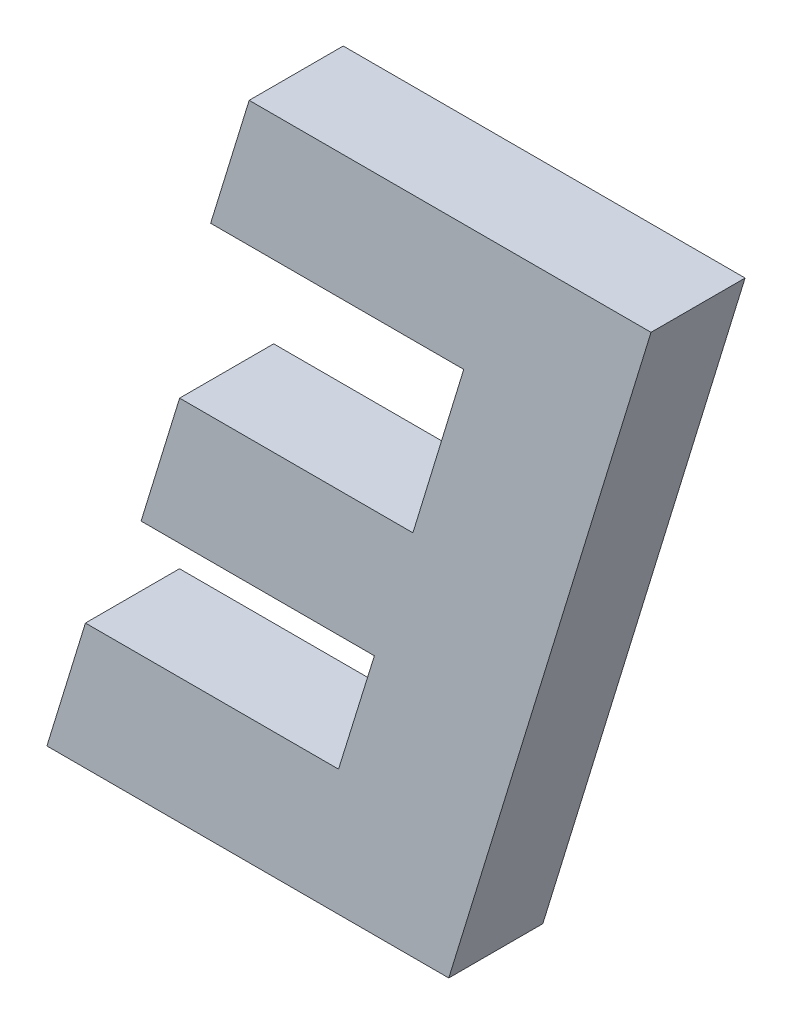
ISO-10303-21;
HEADER;
FILE_DESCRIPTION(('STEP AP214'),'2;1');
FILE_NAME('part.step','',(''),(''),'','','');
FILE_SCHEMA(('AUTOMOTIVE_DESIGN { 1 0 10303 214 1 1 1 1 }'));
ENDSEC;
DATA;
#1=APPLICATION_CONTEXT('core data for automotive mechanical design processes');
#2=APPLICATION_PROTOCOL_DEFINITION('international standard','automotive_design',2000,#1);
#3=PRODUCT_CONTEXT('',#1,'mechanical');
#4=PRODUCT('Part','Part','',(#3));
#5=PRODUCT_RELATED_PRODUCT_CATEGORY('part','',(#4));
#6=PRODUCT_DEFINITION_FORMATION('','',#4);
#7=PRODUCT_DEFINITION_CONTEXT('part definition',#1,'design');
#8=PRODUCT_DEFINITION('design','',#6,#7);
#9=PRODUCT_DEFINITION_SHAPE('','',#8);
#10=(LENGTH_UNIT() NAMED_UNIT(*) SI_UNIT(.MILLI.,.METRE.));
#11=(NAMED_UNIT(*) PLANE_ANGLE_UNIT() SI_UNIT($,.RADIAN.));
#12=(NAMED_UNIT(*) SI_UNIT($,.STERADIAN.) SOLID_ANGLE_UNIT());
#13=UNCERTAINTY_MEASURE_WITH_UNIT(LENGTH_MEASURE(1.E-05),#10,'distance_accuracy_value','');
#14=(GEOMETRIC_REPRESENTATION_CONTEXT(3) GLOBAL_UNCERTAINTY_ASSIGNED_CONTEXT((#13)) GLOBAL_UNIT_ASSIGNED_CONTEXT((#10,
#11,#12)) REPRESENTATION_CONTEXT('',''));
#15=CARTESIAN_POINT('',(0.,0.,0.));
#16=DIRECTION('',(0.,0.,1.));
#17=DIRECTION('',(1.,0.,0.));
#18=AXIS2_PLACEMENT_3D('',#15,#16,#17);
#19=CARTESIAN_POINT('',(5.3775022957308,0.710320131808521,0.));
#20=DIRECTION('',(0.,-1.,0.));
#21=DIRECTION('',(1.,0.,0.));
#22=AXIS2_PLACEMENT_3D('',#19,#20,#21);
#23=PLANE('',#22);
#24=DIRECTION('',(-1.,0.,0.));
#25=VECTOR('',#24,1.);
#26=CARTESIAN_POINT('',(5.8047324640157,0.710320131808521,0.));
#27=LINE('',#26,#25);
#28=CARTESIAN_POINT('',(5.8047324640157,0.710320131808521,0.));
#29=VERTEX_POINT('',#28);
#30=CARTESIAN_POINT('',(5.3775022957308,0.710320131808521,0.));
#31=VERTEX_POINT('',#30);
#32=EDGE_CURVE('E11',#29,#31,#27,.T.);
#33=ORIENTED_EDGE('',*,*,#32,.F.);
#34=DIRECTION('',(0.,0.,1.));
#35=VECTOR('',#34,1.);
#36=CARTESIAN_POINT('',(5.8047324640157,0.710320131808521,0.));
#37=LINE('',#36,#35);
#38=CARTESIAN_POINT('',(5.8047324640157,0.710320131808521,0.1));
#39=VERTEX_POINT('',#38);
#40=EDGE_CURVE('E24',#29,#39,#37,.T.);
#41=ORIENTED_EDGE('',*,*,#40,.T.);
#42=DIRECTION('',(1.,0.,0.));
#43=VECTOR('',#42,1.);
#44=CARTESIAN_POINT('',(5.8047324640157,0.710320131808521,0.1));
#45=LINE('',#44,#43);
#46=CARTESIAN_POINT('',(5.3775022957308,0.710320131808521,0.1));
#47=VERTEX_POINT('',#46);
#48=EDGE_CURVE('E124',#47,#39,#45,.T.);
#49=ORIENTED_EDGE('',*,*,#48,.F.);
#50=DIRECTION('',(0.,0.,1.));
#51=VECTOR('',#50,1.);
#52=CARTESIAN_POINT('',(5.3775022957308,0.710320131808521,0.));
#53=LINE('',#52,#51);
#54=EDGE_CURVE('E197',#31,#47,#53,.T.);
#55=ORIENTED_EDGE('',*,*,#54,.F.);
#56=EDGE_LOOP('',(#33,#41,#49,#55));
#57=FACE_BOUND('',#56,.T.);
#58=ADVANCED_FACE('F17',(#57),#23,.T.);
#59=CARTESIAN_POINT('',(5.4184617792415,0.844007334933629,0.));
#60=DIRECTION('',(-0.956130206843126,0.292942020820027,0.));
#61=DIRECTION('',(-0.292942020820027,-0.956130206843126,0.));
#62=AXIS2_PLACEMENT_3D('',#59,#60,#61);
#63=PLANE('',#62);
#64=DIRECTION('',(0.292942020820027,0.956130206843126,0.));
#65=VECTOR('',#64,1.);
#66=CARTESIAN_POINT('',(5.3775022957308,0.710320131808521,0.));
#67=LINE('',#66,#65);
#68=CARTESIAN_POINT('',(5.4184617792415,0.844007334933629,0.));
#69=VERTEX_POINT('',#68);
#70=EDGE_CURVE('E195',#31,#69,#67,.T.);
#71=ORIENTED_EDGE('',*,*,#70,.F.);
#72=ORIENTED_EDGE('',*,*,#54,.T.);
#73=DIRECTION('',(-0.292942020820027,-0.956130206843126,0.));
#74=VECTOR('',#73,1.);
#75=CARTESIAN_POINT('',(5.3775022957308,0.710320131808521,0.1));
#76=LINE('',#75,#74);
#77=CARTESIAN_POINT('',(5.4184617792415,0.844007334933629,0.1));
#78=VERTEX_POINT('',#77);
#79=EDGE_CURVE('E193',#78,#47,#76,.T.);
#80=ORIENTED_EDGE('',*,*,#79,.F.);
#81=DIRECTION('',(0.,0.,1.));
#82=VECTOR('',#81,1.);
#83=CARTESIAN_POINT('',(5.4184617792415,0.844007334933629,0.));
#84=LINE('',#83,#82);
#85=EDGE_CURVE('E190',#69,#78,#84,.T.);
#86=ORIENTED_EDGE('',*,*,#85,.F.);
#87=EDGE_LOOP('',(#71,#72,#80,#86));
#88=FACE_BOUND('',#87,.T.);
#89=ADVANCED_FACE('F235',(#88),#63,.T.);
#90=CARTESIAN_POINT('',(5.687542830638,0.844007334933629,0.));
#91=DIRECTION('',(0.,1.,0.));
#92=DIRECTION('',(-1.,0.,0.));
#93=AXIS2_PLACEMENT_3D('',#90,#91,#92);
#94=PLANE('',#93);
#95=DIRECTION('',(1.,0.,0.));
#96=VECTOR('',#95,1.);
#97=CARTESIAN_POINT('',(5.4184617792415,0.844007334933629,0.));
#98=LINE('',#97,#96);
#99=CARTESIAN_POINT('',(5.687542830638,0.844007334933629,0.));
#100=VERTEX_POINT('',#99);
#101=EDGE_CURVE('E188',#69,#100,#98,.T.);
#102=ORIENTED_EDGE('',*,*,#101,.F.);
#103=ORIENTED_EDGE('',*,*,#85,.T.);
#104=DIRECTION('',(-1.,0.,0.));
#105=VECTOR('',#104,1.);
#106=CARTESIAN_POINT('',(5.4184617792415,0.844007334933629,0.1));
#107=LINE('',#106,#105);
#108=CARTESIAN_POINT('',(5.687542830638,0.844007334933629,0.1));
#109=VERTEX_POINT('',#108);
#110=EDGE_CURVE('E185',#109,#78,#107,.T.);
#111=ORIENTED_EDGE('',*,*,#110,.F.);
#112=DIRECTION('',(0.,0.,1.));
#113=VECTOR('',#112,1.);
#114=CARTESIAN_POINT('',(5.687542830638,0.844007334933629,0.));
#115=LINE('',#114,#113);
#116=EDGE_CURVE('E182',#100,#109,#115,.T.);
#117=ORIENTED_EDGE('',*,*,#116,.F.);
#118=EDGE_LOOP('',(#102,#103,#111,#117));
#119=FACE_BOUND('',#118,.T.);
#120=ADVANCED_FACE('F231',(#119),#94,.T.);
#121=CARTESIAN_POINT('',(5.7256579055715,0.967454667181068,0.));
#122=DIRECTION('',(-0.955492945435698,0.295013950894893,0.));
#123=DIRECTION('',(-0.295013950894893,-0.955492945435698,0.));
#124=AXIS2_PLACEMENT_3D('',#121,#122,#123);
#125=PLANE('',#124);
#126=DIRECTION('',(0.295013950894893,0.955492945435698,0.));
#127=VECTOR('',#126,1.);
#128=CARTESIAN_POINT('',(5.687542830638,0.844007334933629,0.));
#129=LINE('',#128,#127);
#130=CARTESIAN_POINT('',(5.7256579055715,0.967454667181068,0.));
#131=VERTEX_POINT('',#130);
#132=EDGE_CURVE('E180',#100,#131,#129,.T.);
#133=ORIENTED_EDGE('',*,*,#132,.F.);
#134=ORIENTED_EDGE('',*,*,#116,.T.);
#135=DIRECTION('',(-0.295013950894893,-0.955492945435698,0.));
#136=VECTOR('',#135,1.);
#137=CARTESIAN_POINT('',(5.687542830638,0.844007334933629,0.1));
#138=LINE('',#137,#136);
#139=CARTESIAN_POINT('',(5.7256579055715,0.967454667181068,0.1));
#140=VERTEX_POINT('',#139);
#141=EDGE_CURVE('E177',#140,#109,#138,.T.);
#142=ORIENTED_EDGE('',*,*,#141,.F.);
#143=DIRECTION('',(0.,0.,1.));
#144=VECTOR('',#143,1.);
#145=CARTESIAN_POINT('',(5.7256579055715,0.967454667181068,0.));
#146=LINE('',#145,#144);
#147=EDGE_CURVE('E174',#131,#140,#146,.T.);
#148=ORIENTED_EDGE('',*,*,#147,.F.);
#149=EDGE_LOOP('',(#133,#134,#142,#148));
#150=FACE_BOUND('',#149,.T.);
#151=ADVANCED_FACE('F227',(#150),#125,.T.);
#152=CARTESIAN_POINT('',(5.4776254776458,0.967454667181068,0.));
#153=DIRECTION('',(0.,-1.,0.));
#154=DIRECTION('',(1.,0.,0.));
#155=AXIS2_PLACEMENT_3D('',#152,#153,#154);
#156=PLANE('',#155);
#157=DIRECTION('',(-1.,0.,0.));
#158=VECTOR('',#157,1.);
#159=CARTESIAN_POINT('',(5.7256579055715,0.967454667181068,0.));
#160=LINE('',#159,#158);
#161=CARTESIAN_POINT('',(5.4776254776458,0.967454667181068,0.));
#162=VERTEX_POINT('',#161);
#163=EDGE_CURVE('E172',#131,#162,#160,.T.);
#164=ORIENTED_EDGE('',*,*,#163,.F.);
#165=ORIENTED_EDGE('',*,*,#147,.T.);
#166=DIRECTION('',(1.,0.,0.));
#167=VECTOR('',#166,1.);
#168=CARTESIAN_POINT('',(5.7256579055715,0.967454667181068,0.1));
#169=LINE('',#168,#167);
#170=CARTESIAN_POINT('',(5.4776254776458,0.967454667181068,0.1));
#171=VERTEX_POINT('',#170);
#172=EDGE_CURVE('E169',#171,#140,#169,.T.);
#173=ORIENTED_EDGE('',*,*,#172,.F.);
#174=DIRECTION('',(0.,0.,1.));
#175=VECTOR('',#174,1.);
#176=CARTESIAN_POINT('',(5.4776254776458,0.967454667181068,0.));
#177=LINE('',#176,#175);
#178=EDGE_CURVE('E166',#162,#171,#177,.T.);
#179=ORIENTED_EDGE('',*,*,#178,.F.);
#180=EDGE_LOOP('',(#164,#165,#173,#179));
#181=FACE_BOUND('',#180,.T.);
#182=ADVANCED_FACE('F223',(#181),#156,.T.);
#183=CARTESIAN_POINT('',(5.5185849611564,1.1011418703062,0.));
#184=DIRECTION('',(-0.956130206843126,0.292942020820027,0.));
#185=DIRECTION('',(-0.292942020820027,-0.956130206843126,0.));
#186=AXIS2_PLACEMENT_3D('',#183,#184,#185);
#187=PLANE('',#186);
#188=DIRECTION('',(0.292942020820027,0.956130206843126,0.));
#189=VECTOR('',#188,1.);
#190=CARTESIAN_POINT('',(5.4776254776458,0.967454667181068,0.));
#191=LINE('',#190,#189);
#192=CARTESIAN_POINT('',(5.5185849611564,1.1011418703062,0.));
#193=VERTEX_POINT('',#192);
#194=EDGE_CURVE('E164',#162,#193,#191,.T.);
#195=ORIENTED_EDGE('',*,*,#194,.F.);
#196=ORIENTED_EDGE('',*,*,#178,.T.);
#197=DIRECTION('',(-0.292942020820027,-0.956130206843126,0.));
#198=VECTOR('',#197,1.);
#199=CARTESIAN_POINT('',(5.4776254776458,0.967454667181068,0.1));
#200=LINE('',#199,#198);
#201=CARTESIAN_POINT('',(5.5185849611564,1.1011418703062,0.1));
#202=VERTEX_POINT('',#201);
#203=EDGE_CURVE('E161',#202,#171,#200,.T.);
#204=ORIENTED_EDGE('',*,*,#203,.F.);
#205=DIRECTION('',(0.,0.,1.));
#206=VECTOR('',#205,1.);
#207=CARTESIAN_POINT('',(5.5185849611564,1.1011418703062,0.));
#208=LINE('',#207,#206);
#209=EDGE_CURVE('E158',#193,#202,#208,.T.);
#210=ORIENTED_EDGE('',*,*,#209,.F.);
#211=EDGE_LOOP('',(#195,#196,#204,#210));
#212=FACE_BOUND('',#211,.T.);
#213=ADVANCED_FACE('F219',(#212),#187,.T.);
#214=CARTESIAN_POINT('',(5.7666173890822,1.1011418703062,0.));
#215=DIRECTION('',(0.,1.,0.));
#216=DIRECTION('',(-1.,0.,0.));
#217=AXIS2_PLACEMENT_3D('',#214,#215,#216);
#218=PLANE('',#217);
#219=DIRECTION('',(1.,0.,0.));
#220=VECTOR('',#219,1.);
#221=CARTESIAN_POINT('',(5.5185849611564,1.1011418703062,0.));
#222=LINE('',#221,#220);
#223=CARTESIAN_POINT('',(5.7666173890822,1.1011418703062,0.));
#224=VERTEX_POINT('',#223);
#225=EDGE_CURVE('E156',#193,#224,#222,.T.);
#226=ORIENTED_EDGE('',*,*,#225,.F.);
#227=ORIENTED_EDGE('',*,*,#209,.T.);
#228=DIRECTION('',(-1.,0.,0.));
#229=VECTOR('',#228,1.);
#230=CARTESIAN_POINT('',(5.5185849611564,1.1011418703062,0.1));
#231=LINE('',#230,#229);
#232=CARTESIAN_POINT('',(5.7666173890822,1.1011418703062,0.1));
#233=VERTEX_POINT('',#232);
#234=EDGE_CURVE('E153',#233,#202,#231,.T.);
#235=ORIENTED_EDGE('',*,*,#234,.F.);
#236=DIRECTION('',(0.,0.,1.));
#237=VECTOR('',#236,1.);
#238=CARTESIAN_POINT('',(5.7666173890822,1.1011418703062,0.));
#239=LINE('',#238,#237);
#240=EDGE_CURVE('E150',#224,#233,#239,.T.);
#241=ORIENTED_EDGE('',*,*,#240,.F.);
#242=EDGE_LOOP('',(#226,#227,#235,#241));
#243=FACE_BOUND('',#242,.T.);
#244=ADVANCED_FACE('F215',(#243),#218,.T.);
#245=CARTESIAN_POINT('',(5.8206611520476,1.2786329655191,0.));
#246=DIRECTION('',(-0.95663673942414,0.291283622581068,0.));
#247=DIRECTION('',(-0.291283622581068,-0.95663673942414,0.));
#248=AXIS2_PLACEMENT_3D('',#245,#246,#247);
#249=PLANE('',#248);
#250=DIRECTION('',(0.291283622581068,0.95663673942414,0.));
#251=VECTOR('',#250,1.);
#252=CARTESIAN_POINT('',(5.7666173890822,1.1011418703062,0.));
#253=LINE('',#252,#251);
#254=CARTESIAN_POINT('',(5.8206611520476,1.2786329655191,0.));
#255=VERTEX_POINT('',#254);
#256=EDGE_CURVE('E148',#224,#255,#253,.T.);
#257=ORIENTED_EDGE('',*,*,#256,.F.);
#258=ORIENTED_EDGE('',*,*,#240,.T.);
#259=DIRECTION('',(-0.291283622581068,-0.95663673942414,0.));
#260=VECTOR('',#259,1.);
#261=CARTESIAN_POINT('',(5.7666173890822,1.1011418703062,0.1));
#262=LINE('',#261,#260);
#263=CARTESIAN_POINT('',(5.8206611520476,1.2786329655191,0.1));
#264=VERTEX_POINT('',#263);
#265=EDGE_CURVE('E145',#264,#233,#262,.T.);
#266=ORIENTED_EDGE('',*,*,#265,.F.);
#267=DIRECTION('',(0.,0.,1.));
#268=VECTOR('',#267,1.);
#269=CARTESIAN_POINT('',(5.8206611520476,1.2786329655191,0.));
#270=LINE('',#269,#268);
#271=EDGE_CURVE('E142',#255,#264,#270,.T.);
#272=ORIENTED_EDGE('',*,*,#271,.F.);
#273=EDGE_LOOP('',(#257,#258,#266,#272));
#274=FACE_BOUND('',#273,.T.);
#275=ADVANCED_FACE('F211',(#274),#249,.T.);
#276=CARTESIAN_POINT('',(5.5515801006511,1.2786329655191,0.));
#277=DIRECTION('',(0.,-1.,0.));
#278=DIRECTION('',(1.,0.,0.));
#279=AXIS2_PLACEMENT_3D('',#276,#277,#278);
#280=PLANE('',#279);
#281=DIRECTION('',(-1.,0.,0.));
#282=VECTOR('',#281,1.);
#283=CARTESIAN_POINT('',(5.8206611520476,1.2786329655191,0.));
#284=LINE('',#283,#282);
#285=CARTESIAN_POINT('',(5.5515801006511,1.2786329655191,0.));
#286=VERTEX_POINT('',#285);
#287=EDGE_CURVE('E140',#255,#286,#284,.T.);
#288=ORIENTED_EDGE('',*,*,#287,.F.);
#289=ORIENTED_EDGE('',*,*,#271,.T.);
#290=DIRECTION('',(1.,0.,0.));
#291=VECTOR('',#290,1.);
#292=CARTESIAN_POINT('',(5.8206611520476,1.2786329655191,0.1));
#293=LINE('',#292,#291);
#294=CARTESIAN_POINT('',(5.5515801006511,1.2786329655191,0.1));
#295=VERTEX_POINT('',#294);
#296=EDGE_CURVE('E137',#295,#264,#293,.T.);
#297=ORIENTED_EDGE('',*,*,#296,.F.);
#298=DIRECTION('',(0.,0.,1.));
#299=VECTOR('',#298,1.);
#300=CARTESIAN_POINT('',(5.5515801006511,1.2786329655191,0.));
#301=LINE('',#300,#299);
#302=EDGE_CURVE('E134',#286,#295,#301,.T.);
#303=ORIENTED_EDGE('',*,*,#302,.F.);
#304=EDGE_LOOP('',(#288,#289,#297,#303));
#305=FACE_BOUND('',#304,.T.);
#306=ADVANCED_FACE('F207',(#305),#280,.T.);
#307=CARTESIAN_POINT('',(5.5925395841618,1.4123201686442,0.));
#308=DIRECTION('',(-0.956130206843128,0.292942020820019,0.));
#309=DIRECTION('',(-0.292942020820019,-0.956130206843128,0.));
#310=AXIS2_PLACEMENT_3D('',#307,#308,#309);
#311=PLANE('',#310);
#312=DIRECTION('',(0.292942020820019,0.956130206843128,0.));
#313=VECTOR('',#312,1.);
#314=CARTESIAN_POINT('',(5.5515801006511,1.2786329655191,0.));
#315=LINE('',#314,#313);
#316=CARTESIAN_POINT('',(5.5925395841618,1.4123201686442,0.));
#317=VERTEX_POINT('',#316);
#318=EDGE_CURVE('E132',#286,#317,#315,.T.);
#319=ORIENTED_EDGE('',*,*,#318,.F.);
#320=ORIENTED_EDGE('',*,*,#302,.T.);
#321=DIRECTION('',(-0.292942020820019,-0.956130206843128,0.));
#322=VECTOR('',#321,1.);
#323=CARTESIAN_POINT('',(5.5515801006511,1.2786329655191,0.1));
#324=LINE('',#323,#322);
#325=CARTESIAN_POINT('',(5.5925395841618,1.4123201686442,0.1));
#326=VERTEX_POINT('',#325);
#327=EDGE_CURVE('E130',#326,#295,#324,.T.);
#328=ORIENTED_EDGE('',*,*,#327,.F.);
#329=DIRECTION('',(0.,0.,1.));
#330=VECTOR('',#329,1.);
#331=CARTESIAN_POINT('',(5.5925395841618,1.4123201686442,0.));
#332=LINE('',#331,#330);
#333=EDGE_CURVE('E109',#317,#326,#332,.T.);
#334=ORIENTED_EDGE('',*,*,#333,.F.);
#335=EDGE_LOOP('',(#319,#320,#328,#334));
#336=FACE_BOUND('',#335,.T.);
#337=ADVANCED_FACE('F205',(#336),#311,.T.);
#338=CARTESIAN_POINT('',(6.0197697524467,1.4123201686442,0.));
#339=DIRECTION('',(0.,1.,0.));
#340=DIRECTION('',(-1.,0.,0.));
#341=AXIS2_PLACEMENT_3D('',#338,#339,#340);
#342=PLANE('',#341);
#343=DIRECTION('',(1.,0.,0.));
#344=VECTOR('',#343,1.);
#345=CARTESIAN_POINT('',(5.5925395841618,1.4123201686442,0.));
#346=LINE('',#345,#344);
#347=CARTESIAN_POINT('',(6.0197697524467,1.4123201686442,0.));
#348=VERTEX_POINT('',#347);
#349=EDGE_CURVE('E113',#317,#348,#346,.T.);
#350=ORIENTED_EDGE('',*,*,#349,.F.);
#351=ORIENTED_EDGE('',*,*,#333,.T.);
#352=DIRECTION('',(-1.,0.,0.));
#353=VECTOR('',#352,1.);
#354=CARTESIAN_POINT('',(5.5925395841618,1.4123201686442,0.1));
#355=LINE('',#354,#353);
#356=CARTESIAN_POINT('',(6.0197697524467,1.4123201686442,0.1));
#357=VERTEX_POINT('',#356);
#358=EDGE_CURVE('E102',#357,#326,#355,.T.);
#359=ORIENTED_EDGE('',*,*,#358,.F.);
#360=DIRECTION('',(0.,0.,1.));
#361=VECTOR('',#360,1.);
#362=CARTESIAN_POINT('',(6.0197697524467,1.4123201686442,0.));
#363=LINE('',#362,#361);
#364=EDGE_CURVE('E106',#348,#357,#363,.T.);
#365=ORIENTED_EDGE('',*,*,#364,.F.);
#366=EDGE_LOOP('',(#350,#351,#359,#365));
#367=FACE_BOUND('',#366,.T.);
#368=ADVANCED_FACE('F105',(#367),#342,.T.);
#369=CARTESIAN_POINT('',(5.8047324640157,0.710320131808521,0.));
#370=DIRECTION('',(0.956146828433078,-0.292887764301218,0.));
#371=DIRECTION('',(0.292887764301218,0.956146828433078,0.));
#372=AXIS2_PLACEMENT_3D('',#369,#370,#371);
#373=PLANE('',#372);
#374=DIRECTION('',(-0.292887764301218,-0.956146828433078,0.));
#375=VECTOR('',#374,1.);
#376=CARTESIAN_POINT('',(6.0197697524467,1.4123201686442,0.));
#377=LINE('',#376,#375);
#378=EDGE_CURVE('E119',#348,#29,#377,.T.);
#379=ORIENTED_EDGE('',*,*,#378,.F.);
#380=ORIENTED_EDGE('',*,*,#364,.T.);
#381=DIRECTION('',(0.292887764301218,0.956146828433078,0.));
#382=VECTOR('',#381,1.);
#383=CARTESIAN_POINT('',(6.0197697524467,1.4123201686442,0.1));
#384=LINE('',#383,#382);
#385=EDGE_CURVE('E118',#39,#357,#384,.T.);
#386=ORIENTED_EDGE('',*,*,#385,.F.);
#387=ORIENTED_EDGE('',*,*,#40,.F.);
#388=EDGE_LOOP('',(#379,#380,#386,#387));
#389=FACE_BOUND('',#388,.T.);
#390=ADVANCED_FACE('F117',(#389),#373,.T.);
#391=CARTESIAN_POINT('',(5.70078244351,1.0573194609244,0.));
#392=DIRECTION('',(0.,0.,1.));
#393=DIRECTION('',(1.,0.,0.));
#394=AXIS2_PLACEMENT_3D('',#391,#392,#393);
#395=PLANE('',#394);
#396=ORIENTED_EDGE('',*,*,#378,.T.);
#397=ORIENTED_EDGE('',*,*,#32,.T.);
#398=ORIENTED_EDGE('',*,*,#70,.T.);
#399=ORIENTED_EDGE('',*,*,#101,.T.);
#400=ORIENTED_EDGE('',*,*,#132,.T.);
#401=ORIENTED_EDGE('',*,*,#163,.T.);
#402=ORIENTED_EDGE('',*,*,#194,.T.);
#403=ORIENTED_EDGE('',*,*,#225,.T.);
#404=ORIENTED_EDGE('',*,*,#256,.T.);
#405=ORIENTED_EDGE('',*,*,#287,.T.);
#406=ORIENTED_EDGE('',*,*,#318,.T.);
#407=ORIENTED_EDGE('',*,*,#349,.T.);
#408=EDGE_LOOP('',(#396,#397,#398,#399,#400,#401,#402,#403,#404,#405,#406,#407));
#409=FACE_BOUND('',#408,.T.);
#410=ADVANCED_FACE('F200',(#409),#395,.F.);
#411=CARTESIAN_POINT('',(5.70078244351,1.0573194609244,0.1));
#412=DIRECTION('',(0.,0.,1.));
#413=DIRECTION('',(1.,0.,0.));
#414=AXIS2_PLACEMENT_3D('',#411,#412,#413);
#415=PLANE('',#414);
#416=ORIENTED_EDGE('',*,*,#385,.T.);
#417=ORIENTED_EDGE('',*,*,#358,.T.);
#418=ORIENTED_EDGE('',*,*,#327,.T.);
#419=ORIENTED_EDGE('',*,*,#296,.T.);
#420=ORIENTED_EDGE('',*,*,#265,.T.);
#421=ORIENTED_EDGE('',*,*,#234,.T.);
#422=ORIENTED_EDGE('',*,*,#203,.T.);
#423=ORIENTED_EDGE('',*,*,#172,.T.);
#424=ORIENTED_EDGE('',*,*,#141,.T.);
#425=ORIENTED_EDGE('',*,*,#110,.T.);
#426=ORIENTED_EDGE('',*,*,#79,.T.);
#427=ORIENTED_EDGE('',*,*,#48,.T.);
#428=EDGE_LOOP('',(#416,#417,#418,#419,#420,#421,#422,#423,#424,#425,#426,#427));
#429=FACE_BOUND('',#428,.T.);
#430=ADVANCED_FACE('F122',(#429),#415,.T.);
#431=CLOSED_SHELL('',(#58,#89,#120,#151,#182,#213,#244,#275,#306,#337,#368,#390,#410,#430));
#432=MANIFOLD_SOLID_BREP('B1',#431);
#433=ADVANCED_BREP_SHAPE_REPRESENTATION('',(#18,#432),#14);
#434=SHAPE_DEFINITION_REPRESENTATION(#9,#433);
ENDSEC;
END-ISO-10303-21;
